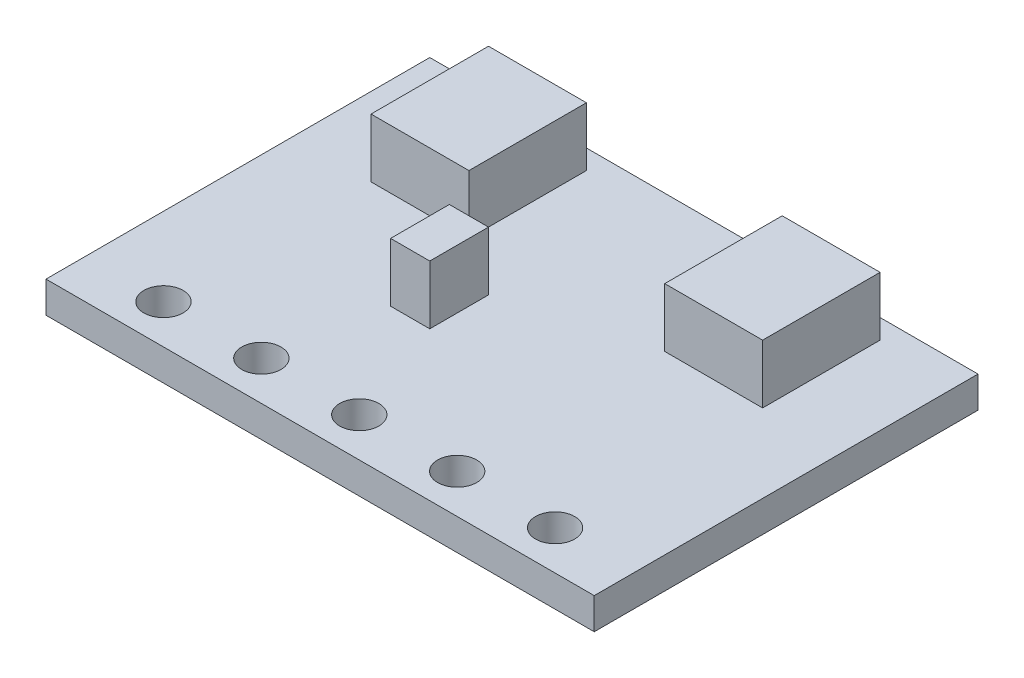
ISO-10303-21;
HEADER;
FILE_DESCRIPTION(('STEP AP214'),'2;1');
FILE_NAME('part.step','',(''),(''),'','','');
FILE_SCHEMA(('AUTOMOTIVE_DESIGN { 1 0 10303 214 1 1 1 1 }'));
ENDSEC;
DATA;
#1=APPLICATION_CONTEXT('core data for automotive mechanical design processes');
#2=APPLICATION_PROTOCOL_DEFINITION('international standard','automotive_design',2000,#1);
#3=PRODUCT_CONTEXT('',#1,'mechanical');
#4=PRODUCT('Part','Part','',(#3));
#5=PRODUCT_RELATED_PRODUCT_CATEGORY('part','',(#4));
#6=PRODUCT_DEFINITION_FORMATION('','',#4);
#7=PRODUCT_DEFINITION_CONTEXT('part definition',#1,'design');
#8=PRODUCT_DEFINITION('design','',#6,#7);
#9=PRODUCT_DEFINITION_SHAPE('','',#8);
#10=(LENGTH_UNIT() NAMED_UNIT(*) SI_UNIT(.MILLI.,.METRE.));
#11=(NAMED_UNIT(*) PLANE_ANGLE_UNIT() SI_UNIT($,.RADIAN.));
#12=(NAMED_UNIT(*) SI_UNIT($,.STERADIAN.) SOLID_ANGLE_UNIT());
#13=UNCERTAINTY_MEASURE_WITH_UNIT(LENGTH_MEASURE(1.E-05),#10,'distance_accuracy_value','');
#14=(GEOMETRIC_REPRESENTATION_CONTEXT(3) GLOBAL_UNCERTAINTY_ASSIGNED_CONTEXT((#13)) GLOBAL_UNIT_ASSIGNED_CONTEXT((#10,
#11,#12)) REPRESENTATION_CONTEXT('',''));
#15=CARTESIAN_POINT('',(0.,0.,0.));
#16=DIRECTION('',(0.,0.,1.));
#17=DIRECTION('',(1.,0.,0.));
#18=AXIS2_PLACEMENT_3D('',#15,#16,#17);
#19=CARTESIAN_POINT('',(7.,3.3,4.9));
#20=DIRECTION('',(-1.,0.,0.));
#21=DIRECTION('',(0.,0.,1.));
#22=AXIS2_PLACEMENT_3D('',#19,#20,#21);
#23=PLANE('',#22);
#24=DIRECTION('',(0.,0.,1.));
#25=VECTOR('',#24,1.);
#26=CARTESIAN_POINT('',(7.,1.,0.));
#27=LINE('',#26,#25);
#28=CARTESIAN_POINT('',(7.,1.,-4.9));
#29=VERTEX_POINT('',#28);
#30=CARTESIAN_POINT('',(7.,1.,4.9));
#31=VERTEX_POINT('',#30);
#32=EDGE_CURVE('E60',#29,#31,#27,.T.);
#33=ORIENTED_EDGE('',*,*,#32,.F.);
#34=DIRECTION('',(0.,-1.,0.));
#35=VECTOR('',#34,1.);
#36=CARTESIAN_POINT('',(7.,3.3,-4.9));
#37=LINE('',#36,#35);
#38=CARTESIAN_POINT('',(7.,1.8,-4.9));
#39=VERTEX_POINT('',#38);
#40=EDGE_CURVE('E11',#39,#29,#37,.T.);
#41=ORIENTED_EDGE('',*,*,#40,.F.);
#42=DIRECTION('',(0.,0.,-1.));
#43=VECTOR('',#42,1.);
#44=CARTESIAN_POINT('',(7.,1.8,0.));
#45=LINE('',#44,#43);
#46=CARTESIAN_POINT('',(7.,1.8,4.9));
#47=VERTEX_POINT('',#46);
#48=EDGE_CURVE('E207',#47,#39,#45,.T.);
#49=ORIENTED_EDGE('',*,*,#48,.F.);
#50=DIRECTION('',(0.,-1.,0.));
#51=VECTOR('',#50,1.);
#52=CARTESIAN_POINT('',(7.,3.3,4.9));
#53=LINE('',#52,#51);
#54=EDGE_CURVE('E196',#47,#31,#53,.T.);
#55=ORIENTED_EDGE('',*,*,#54,.T.);
#56=EDGE_LOOP('',(#33,#41,#49,#55));
#57=FACE_BOUND('',#56,.T.);
#58=ADVANCED_FACE('F45',(#57),#23,.F.);
#59=CARTESIAN_POINT('',(-7.,3.3,-4.9));
#60=DIRECTION('',(0.,0.,1.));
#61=DIRECTION('',(1.,0.,0.));
#62=AXIS2_PLACEMENT_3D('',#59,#60,#61);
#63=PLANE('',#62);
#64=DIRECTION('',(1.,0.,0.));
#65=VECTOR('',#64,1.);
#66=CARTESIAN_POINT('',(0.,1.,-4.9));
#67=LINE('',#66,#65);
#68=CARTESIAN_POINT('',(-7.,1.,-4.9));
#69=VERTEX_POINT('',#68);
#70=EDGE_CURVE('E180',#69,#29,#67,.T.);
#71=ORIENTED_EDGE('',*,*,#70,.F.);
#72=DIRECTION('',(0.,-1.,0.));
#73=VECTOR('',#72,1.);
#74=CARTESIAN_POINT('',(-7.,3.3,-4.9));
#75=LINE('',#74,#73);
#76=CARTESIAN_POINT('',(-7.,1.8,-4.9));
#77=VERTEX_POINT('',#76);
#78=EDGE_CURVE('E53',#77,#69,#75,.T.);
#79=ORIENTED_EDGE('',*,*,#78,.F.);
#80=DIRECTION('',(-1.,0.,0.));
#81=VECTOR('',#80,1.);
#82=CARTESIAN_POINT('',(0.,1.8,-4.9));
#83=LINE('',#82,#81);
#84=EDGE_CURVE('E202',#39,#77,#83,.T.);
#85=ORIENTED_EDGE('',*,*,#84,.F.);
#86=ORIENTED_EDGE('',*,*,#40,.T.);
#87=EDGE_LOOP('',(#71,#79,#85,#86));
#88=FACE_BOUND('',#87,.T.);
#89=ADVANCED_FACE('F201',(#88),#63,.F.);
#90=CARTESIAN_POINT('',(-7.,3.3,4.9));
#91=DIRECTION('',(1.,0.,0.));
#92=DIRECTION('',(0.,0.,-1.));
#93=AXIS2_PLACEMENT_3D('',#90,#91,#92);
#94=PLANE('',#93);
#95=DIRECTION('',(0.,0.,-1.));
#96=VECTOR('',#95,1.);
#97=CARTESIAN_POINT('',(-7.,1.,0.));
#98=LINE('',#97,#96);
#99=CARTESIAN_POINT('',(-7.,1.,4.9));
#100=VERTEX_POINT('',#99);
#101=EDGE_CURVE('E184',#100,#69,#98,.T.);
#102=ORIENTED_EDGE('',*,*,#101,.F.);
#103=DIRECTION('',(0.,-1.,0.));
#104=VECTOR('',#103,1.);
#105=CARTESIAN_POINT('',(-7.,3.3,4.9));
#106=LINE('',#105,#104);
#107=CARTESIAN_POINT('',(-7.,1.8,4.9));
#108=VERTEX_POINT('',#107);
#109=EDGE_CURVE('E307',#108,#100,#106,.T.);
#110=ORIENTED_EDGE('',*,*,#109,.F.);
#111=DIRECTION('',(0.,0.,1.));
#112=VECTOR('',#111,1.);
#113=CARTESIAN_POINT('',(-7.,1.8,0.));
#114=LINE('',#113,#112);
#115=EDGE_CURVE('E206',#77,#108,#114,.T.);
#116=ORIENTED_EDGE('',*,*,#115,.F.);
#117=ORIENTED_EDGE('',*,*,#78,.T.);
#118=EDGE_LOOP('',(#102,#110,#116,#117));
#119=FACE_BOUND('',#118,.T.);
#120=ADVANCED_FACE('F312',(#119),#94,.F.);
#121=CARTESIAN_POINT('',(-7.,3.3,4.9));
#122=DIRECTION('',(0.,0.,-1.));
#123=DIRECTION('',(-1.,0.,0.));
#124=AXIS2_PLACEMENT_3D('',#121,#122,#123);
#125=PLANE('',#124);
#126=DIRECTION('',(-1.,0.,0.));
#127=VECTOR('',#126,1.);
#128=CARTESIAN_POINT('',(0.,1.,4.9));
#129=LINE('',#128,#127);
#130=EDGE_CURVE('E198',#31,#100,#129,.T.);
#131=ORIENTED_EDGE('',*,*,#130,.F.);
#132=ORIENTED_EDGE('',*,*,#54,.F.);
#133=DIRECTION('',(1.,0.,0.));
#134=VECTOR('',#133,1.);
#135=CARTESIAN_POINT('',(0.,1.8,4.9));
#136=LINE('',#135,#134);
#137=EDGE_CURVE('E213',#108,#47,#136,.T.);
#138=ORIENTED_EDGE('',*,*,#137,.F.);
#139=ORIENTED_EDGE('',*,*,#109,.T.);
#140=EDGE_LOOP('',(#131,#132,#138,#139));
#141=FACE_BOUND('',#140,.T.);
#142=ADVANCED_FACE('F317',(#141),#125,.F.);
#143=CARTESIAN_POINT('',(-2.5,1.8,0.));
#144=DIRECTION('',(1.,0.,0.));
#145=DIRECTION('',(0.,0.,-1.));
#146=AXIS2_PLACEMENT_3D('',#143,#144,#145);
#147=PLANE('',#146);
#148=DIRECTION('',(0.,0.,-1.));
#149=VECTOR('',#148,1.);
#150=CARTESIAN_POINT('',(-2.5,3.3,0.));
#151=LINE('',#150,#149);
#152=CARTESIAN_POINT('',(-2.5,3.3,-1.4));
#153=VERTEX_POINT('',#152);
#154=CARTESIAN_POINT('',(-2.5,3.3,-4.4));
#155=VERTEX_POINT('',#154);
#156=EDGE_CURVE('E250',#153,#155,#151,.T.);
#157=ORIENTED_EDGE('',*,*,#156,.F.);
#158=DIRECTION('',(0.,1.,0.));
#159=VECTOR('',#158,1.);
#160=CARTESIAN_POINT('',(-2.5,1.8,-1.4));
#161=LINE('',#160,#159);
#162=CARTESIAN_POINT('',(-2.5,1.8,-1.4));
#163=VERTEX_POINT('',#162);
#164=EDGE_CURVE('E276',#163,#153,#161,.T.);
#165=ORIENTED_EDGE('',*,*,#164,.F.);
#166=DIRECTION('',(0.,0.,-1.));
#167=VECTOR('',#166,1.);
#168=CARTESIAN_POINT('',(-2.5,1.8,0.));
#169=LINE('',#168,#167);
#170=CARTESIAN_POINT('',(-2.5,1.8,-4.4));
#171=VERTEX_POINT('',#170);
#172=EDGE_CURVE('E331',#163,#171,#169,.T.);
#173=ORIENTED_EDGE('',*,*,#172,.T.);
#174=DIRECTION('',(0.,1.,0.));
#175=VECTOR('',#174,1.);
#176=CARTESIAN_POINT('',(-2.5,1.8,-4.4));
#177=LINE('',#176,#175);
#178=EDGE_CURVE('E267',#171,#155,#177,.T.);
#179=ORIENTED_EDGE('',*,*,#178,.T.);
#180=EDGE_LOOP('',(#157,#165,#173,#179));
#181=FACE_BOUND('',#180,.T.);
#182=ADVANCED_FACE('F485',(#181),#147,.T.);
#183=CARTESIAN_POINT('',(0.,1.8,-4.4));
#184=DIRECTION('',(0.,0.,1.));
#185=DIRECTION('',(1.,0.,0.));
#186=AXIS2_PLACEMENT_3D('',#183,#184,#185);
#187=PLANE('',#186);
#188=DIRECTION('',(1.,0.,0.));
#189=VECTOR('',#188,1.);
#190=CARTESIAN_POINT('',(0.,3.3,-4.4));
#191=LINE('',#190,#189);
#192=CARTESIAN_POINT('',(-5.,3.3,-4.4));
#193=VERTEX_POINT('',#192);
#194=EDGE_CURVE('E262',#193,#155,#191,.T.);
#195=ORIENTED_EDGE('',*,*,#194,.T.);
#196=ORIENTED_EDGE('',*,*,#178,.F.);
#197=DIRECTION('',(1.,0.,0.));
#198=VECTOR('',#197,1.);
#199=CARTESIAN_POINT('',(0.,1.8,-4.4));
#200=LINE('',#199,#198);
#201=CARTESIAN_POINT('',(-5.,1.8,-4.4));
#202=VERTEX_POINT('',#201);
#203=EDGE_CURVE('E319',#202,#171,#200,.T.);
#204=ORIENTED_EDGE('',*,*,#203,.F.);
#205=DIRECTION('',(0.,1.,0.));
#206=VECTOR('',#205,1.);
#207=CARTESIAN_POINT('',(-5.,1.8,-4.4));
#208=LINE('',#207,#206);
#209=EDGE_CURVE('E270',#202,#193,#208,.T.);
#210=ORIENTED_EDGE('',*,*,#209,.T.);
#211=EDGE_LOOP('',(#195,#196,#204,#210));
#212=FACE_BOUND('',#211,.T.);
#213=ADVANCED_FACE('F529',(#212),#187,.F.);
#214=CARTESIAN_POINT('',(-5.,1.8,0.));
#215=DIRECTION('',(1.,0.,0.));
#216=DIRECTION('',(0.,0.,-1.));
#217=AXIS2_PLACEMENT_3D('',#214,#215,#216);
#218=PLANE('',#217);
#219=DIRECTION('',(0.,0.,-1.));
#220=VECTOR('',#219,1.);
#221=CARTESIAN_POINT('',(-5.,3.3,0.));
#222=LINE('',#221,#220);
#223=CARTESIAN_POINT('',(-5.,3.3,-1.4));
#224=VERTEX_POINT('',#223);
#225=EDGE_CURVE('E258',#224,#193,#222,.T.);
#226=ORIENTED_EDGE('',*,*,#225,.T.);
#227=ORIENTED_EDGE('',*,*,#209,.F.);
#228=DIRECTION('',(0.,0.,-1.));
#229=VECTOR('',#228,1.);
#230=CARTESIAN_POINT('',(-5.,1.8,0.));
#231=LINE('',#230,#229);
#232=CARTESIAN_POINT('',(-5.,1.8,-1.4));
#233=VERTEX_POINT('',#232);
#234=EDGE_CURVE('E322',#233,#202,#231,.T.);
#235=ORIENTED_EDGE('',*,*,#234,.F.);
#236=DIRECTION('',(0.,1.,0.));
#237=VECTOR('',#236,1.);
#238=CARTESIAN_POINT('',(-5.,1.8,-1.4));
#239=LINE('',#238,#237);
#240=EDGE_CURVE('E273',#233,#224,#239,.T.);
#241=ORIENTED_EDGE('',*,*,#240,.T.);
#242=EDGE_LOOP('',(#226,#227,#235,#241));
#243=FACE_BOUND('',#242,.T.);
#244=ADVANCED_FACE('F516',(#243),#218,.F.);
#245=CARTESIAN_POINT('',(5.,1.8,0.));
#246=DIRECTION('',(1.,0.,0.));
#247=DIRECTION('',(0.,0.,-1.));
#248=AXIS2_PLACEMENT_3D('',#245,#246,#247);
#249=PLANE('',#248);
#250=DIRECTION('',(0.,0.,-1.));
#251=VECTOR('',#250,1.);
#252=CARTESIAN_POINT('',(5.,3.3,0.));
#253=LINE('',#252,#251);
#254=CARTESIAN_POINT('',(5.,3.3,-1.4));
#255=VERTEX_POINT('',#254);
#256=CARTESIAN_POINT('',(5.,3.3,-4.4));
#257=VERTEX_POINT('',#256);
#258=EDGE_CURVE('E234',#255,#257,#253,.T.);
#259=ORIENTED_EDGE('',*,*,#258,.F.);
#260=DIRECTION('',(0.,1.,0.));
#261=VECTOR('',#260,1.);
#262=CARTESIAN_POINT('',(5.,1.8,-1.4));
#263=LINE('',#262,#261);
#264=CARTESIAN_POINT('',(5.,1.8,-1.4));
#265=VERTEX_POINT('',#264);
#266=EDGE_CURVE('E289',#265,#255,#263,.T.);
#267=ORIENTED_EDGE('',*,*,#266,.F.);
#268=DIRECTION('',(0.,0.,-1.));
#269=VECTOR('',#268,1.);
#270=CARTESIAN_POINT('',(5.,1.8,0.));
#271=LINE('',#270,#269);
#272=CARTESIAN_POINT('',(5.,1.8,-4.4));
#273=VERTEX_POINT('',#272);
#274=EDGE_CURVE('E345',#265,#273,#271,.T.);
#275=ORIENTED_EDGE('',*,*,#274,.T.);
#276=DIRECTION('',(0.,1.,0.));
#277=VECTOR('',#276,1.);
#278=CARTESIAN_POINT('',(5.,1.8,-4.4));
#279=LINE('',#278,#277);
#280=EDGE_CURVE('E280',#273,#257,#279,.T.);
#281=ORIENTED_EDGE('',*,*,#280,.T.);
#282=EDGE_LOOP('',(#259,#267,#275,#281));
#283=FACE_BOUND('',#282,.T.);
#284=ADVANCED_FACE('F512',(#283),#249,.T.);
#285=CARTESIAN_POINT('',(0.,1.8,-4.4));
#286=DIRECTION('',(0.,0.,1.));
#287=DIRECTION('',(1.,0.,0.));
#288=AXIS2_PLACEMENT_3D('',#285,#286,#287);
#289=PLANE('',#288);
#290=DIRECTION('',(1.,0.,0.));
#291=VECTOR('',#290,1.);
#292=CARTESIAN_POINT('',(0.,3.3,-4.4));
#293=LINE('',#292,#291);
#294=CARTESIAN_POINT('',(2.5,3.3,-4.4));
#295=VERTEX_POINT('',#294);
#296=EDGE_CURVE('E246',#295,#257,#293,.T.);
#297=ORIENTED_EDGE('',*,*,#296,.T.);
#298=ORIENTED_EDGE('',*,*,#280,.F.);
#299=DIRECTION('',(1.,0.,0.));
#300=VECTOR('',#299,1.);
#301=CARTESIAN_POINT('',(0.,1.8,-4.4));
#302=LINE('',#301,#300);
#303=CARTESIAN_POINT('',(2.5,1.8,-4.4));
#304=VERTEX_POINT('',#303);
#305=EDGE_CURVE('E334',#304,#273,#302,.T.);
#306=ORIENTED_EDGE('',*,*,#305,.F.);
#307=DIRECTION('',(0.,1.,0.));
#308=VECTOR('',#307,1.);
#309=CARTESIAN_POINT('',(2.5,1.8,-4.4));
#310=LINE('',#309,#308);
#311=EDGE_CURVE('E283',#304,#295,#310,.T.);
#312=ORIENTED_EDGE('',*,*,#311,.T.);
#313=EDGE_LOOP('',(#297,#298,#306,#312));
#314=FACE_BOUND('',#313,.T.);
#315=ADVANCED_FACE('F515',(#314),#289,.F.);
#316=CARTESIAN_POINT('',(2.5,1.8,0.));
#317=DIRECTION('',(1.,0.,0.));
#318=DIRECTION('',(0.,0.,-1.));
#319=AXIS2_PLACEMENT_3D('',#316,#317,#318);
#320=PLANE('',#319);
#321=DIRECTION('',(0.,0.,-1.));
#322=VECTOR('',#321,1.);
#323=CARTESIAN_POINT('',(2.5,3.3,0.));
#324=LINE('',#323,#322);
#325=CARTESIAN_POINT('',(2.5,3.3,-1.4));
#326=VERTEX_POINT('',#325);
#327=EDGE_CURVE('E242',#326,#295,#324,.T.);
#328=ORIENTED_EDGE('',*,*,#327,.T.);
#329=ORIENTED_EDGE('',*,*,#311,.F.);
#330=DIRECTION('',(0.,0.,-1.));
#331=VECTOR('',#330,1.);
#332=CARTESIAN_POINT('',(2.5,1.8,0.));
#333=LINE('',#332,#331);
#334=CARTESIAN_POINT('',(2.5,1.8,-1.4));
#335=VERTEX_POINT('',#334);
#336=EDGE_CURVE('E338',#335,#304,#333,.T.);
#337=ORIENTED_EDGE('',*,*,#336,.F.);
#338=DIRECTION('',(0.,1.,0.));
#339=VECTOR('',#338,1.);
#340=CARTESIAN_POINT('',(2.5,1.8,-1.4));
#341=LINE('',#340,#339);
#342=EDGE_CURVE('E286',#335,#326,#341,.T.);
#343=ORIENTED_EDGE('',*,*,#342,.T.);
#344=EDGE_LOOP('',(#328,#329,#337,#343));
#345=FACE_BOUND('',#344,.T.);
#346=ADVANCED_FACE('F497',(#345),#320,.F.);
#347=CARTESIAN_POINT('',(-1.,1.8,0.));
#348=DIRECTION('',(1.,0.,0.));
#349=DIRECTION('',(0.,0.,-1.));
#350=AXIS2_PLACEMENT_3D('',#347,#348,#349);
#351=PLANE('',#350);
#352=DIRECTION('',(0.,0.,-1.));
#353=VECTOR('',#352,1.);
#354=CARTESIAN_POINT('',(-1.,3.3,0.));
#355=LINE('',#354,#353);
#356=CARTESIAN_POINT('',(-1.,3.3,1.1));
#357=VERTEX_POINT('',#356);
#358=CARTESIAN_POINT('',(-1.,3.3,-0.4));
#359=VERTEX_POINT('',#358);
#360=EDGE_CURVE('E217',#357,#359,#355,.T.);
#361=ORIENTED_EDGE('',*,*,#360,.F.);
#362=DIRECTION('',(0.,1.,0.));
#363=VECTOR('',#362,1.);
#364=CARTESIAN_POINT('',(-1.,1.8,1.1));
#365=LINE('',#364,#363);
#366=CARTESIAN_POINT('',(-1.,1.8,1.1));
#367=VERTEX_POINT('',#366);
#368=EDGE_CURVE('E211',#367,#357,#365,.T.);
#369=ORIENTED_EDGE('',*,*,#368,.F.);
#370=DIRECTION('',(0.,0.,-1.));
#371=VECTOR('',#370,1.);
#372=CARTESIAN_POINT('',(-1.,1.8,0.));
#373=LINE('',#372,#371);
#374=CARTESIAN_POINT('',(-1.,1.8,-0.4));
#375=VERTEX_POINT('',#374);
#376=EDGE_CURVE('E266',#367,#375,#373,.T.);
#377=ORIENTED_EDGE('',*,*,#376,.T.);
#378=DIRECTION('',(0.,1.,0.));
#379=VECTOR('',#378,1.);
#380=CARTESIAN_POINT('',(-1.,1.8,-0.4));
#381=LINE('',#380,#379);
#382=EDGE_CURVE('E293',#375,#359,#381,.T.);
#383=ORIENTED_EDGE('',*,*,#382,.T.);
#384=EDGE_LOOP('',(#361,#369,#377,#383));
#385=FACE_BOUND('',#384,.T.);
#386=ADVANCED_FACE('F493',(#385),#351,.T.);
#387=CARTESIAN_POINT('',(0.,1.8,-0.4));
#388=DIRECTION('',(0.,0.,1.));
#389=DIRECTION('',(1.,0.,0.));
#390=AXIS2_PLACEMENT_3D('',#387,#388,#389);
#391=PLANE('',#390);
#392=DIRECTION('',(1.,0.,0.));
#393=VECTOR('',#392,1.);
#394=CARTESIAN_POINT('',(0.,3.3,-0.4));
#395=LINE('',#394,#393);
#396=CARTESIAN_POINT('',(-2.,3.3,-0.4));
#397=VERTEX_POINT('',#396);
#398=EDGE_CURVE('E230',#397,#359,#395,.T.);
#399=ORIENTED_EDGE('',*,*,#398,.T.);
#400=ORIENTED_EDGE('',*,*,#382,.F.);
#401=DIRECTION('',(1.,0.,0.));
#402=VECTOR('',#401,1.);
#403=CARTESIAN_POINT('',(0.,1.8,-0.4));
#404=LINE('',#403,#402);
#405=CARTESIAN_POINT('',(-2.,1.8,-0.4));
#406=VERTEX_POINT('',#405);
#407=EDGE_CURVE('E348',#406,#375,#404,.T.);
#408=ORIENTED_EDGE('',*,*,#407,.F.);
#409=DIRECTION('',(0.,1.,0.));
#410=VECTOR('',#409,1.);
#411=CARTESIAN_POINT('',(-2.,1.8,-0.4));
#412=LINE('',#411,#410);
#413=EDGE_CURVE('E296',#406,#397,#412,.T.);
#414=ORIENTED_EDGE('',*,*,#413,.T.);
#415=EDGE_LOOP('',(#399,#400,#408,#414));
#416=FACE_BOUND('',#415,.T.);
#417=ADVANCED_FACE('F496',(#416),#391,.F.);
#418=CARTESIAN_POINT('',(-2.,1.8,0.));
#419=DIRECTION('',(1.,0.,0.));
#420=DIRECTION('',(0.,0.,-1.));
#421=AXIS2_PLACEMENT_3D('',#418,#419,#420);
#422=PLANE('',#421);
#423=DIRECTION('',(0.,0.,-1.));
#424=VECTOR('',#423,1.);
#425=CARTESIAN_POINT('',(-2.,3.3,0.));
#426=LINE('',#425,#424);
#427=CARTESIAN_POINT('',(-2.,3.3,1.1));
#428=VERTEX_POINT('',#427);
#429=EDGE_CURVE('E226',#428,#397,#426,.T.);
#430=ORIENTED_EDGE('',*,*,#429,.T.);
#431=ORIENTED_EDGE('',*,*,#413,.F.);
#432=DIRECTION('',(0.,0.,-1.));
#433=VECTOR('',#432,1.);
#434=CARTESIAN_POINT('',(-2.,1.8,0.));
#435=LINE('',#434,#433);
#436=CARTESIAN_POINT('',(-2.,1.8,1.1));
#437=VERTEX_POINT('',#436);
#438=EDGE_CURVE('E352',#437,#406,#435,.T.);
#439=ORIENTED_EDGE('',*,*,#438,.F.);
#440=DIRECTION('',(0.,1.,0.));
#441=VECTOR('',#440,1.);
#442=CARTESIAN_POINT('',(-2.,1.8,1.1));
#443=LINE('',#442,#441);
#444=EDGE_CURVE('E299',#437,#428,#443,.T.);
#445=ORIENTED_EDGE('',*,*,#444,.T.);
#446=EDGE_LOOP('',(#430,#431,#439,#445));
#447=FACE_BOUND('',#446,.T.);
#448=ADVANCED_FACE('F504',(#447),#422,.F.);
#449=CARTESIAN_POINT('',(0.,1.8,-1.4));
#450=DIRECTION('',(0.,0.,1.));
#451=DIRECTION('',(1.,0.,0.));
#452=AXIS2_PLACEMENT_3D('',#449,#450,#451);
#453=PLANE('',#452);
#454=DIRECTION('',(1.,0.,0.));
#455=VECTOR('',#454,1.);
#456=CARTESIAN_POINT('',(0.,3.3,-1.4));
#457=LINE('',#456,#455);
#458=EDGE_CURVE('E254',#224,#153,#457,.T.);
#459=ORIENTED_EDGE('',*,*,#458,.F.);
#460=ORIENTED_EDGE('',*,*,#240,.F.);
#461=DIRECTION('',(1.,0.,0.));
#462=VECTOR('',#461,1.);
#463=CARTESIAN_POINT('',(0.,1.8,-1.4));
#464=LINE('',#463,#462);
#465=EDGE_CURVE('E328',#233,#163,#464,.T.);
#466=ORIENTED_EDGE('',*,*,#465,.T.);
#467=ORIENTED_EDGE('',*,*,#164,.T.);
#468=EDGE_LOOP('',(#459,#460,#466,#467));
#469=FACE_BOUND('',#468,.T.);
#470=ADVANCED_FACE('F507',(#469),#453,.T.);
#471=CARTESIAN_POINT('',(0.,1.8,-1.4));
#472=DIRECTION('',(0.,0.,1.));
#473=DIRECTION('',(1.,0.,0.));
#474=AXIS2_PLACEMENT_3D('',#471,#472,#473);
#475=PLANE('',#474);
#476=DIRECTION('',(1.,0.,0.));
#477=VECTOR('',#476,1.);
#478=CARTESIAN_POINT('',(0.,3.3,-1.4));
#479=LINE('',#478,#477);
#480=EDGE_CURVE('E238',#326,#255,#479,.T.);
#481=ORIENTED_EDGE('',*,*,#480,.F.);
#482=ORIENTED_EDGE('',*,*,#342,.F.);
#483=DIRECTION('',(1.,0.,0.));
#484=VECTOR('',#483,1.);
#485=CARTESIAN_POINT('',(0.,1.8,-1.4));
#486=LINE('',#485,#484);
#487=EDGE_CURVE('E342',#335,#265,#486,.T.);
#488=ORIENTED_EDGE('',*,*,#487,.T.);
#489=ORIENTED_EDGE('',*,*,#266,.T.);
#490=EDGE_LOOP('',(#481,#482,#488,#489));
#491=FACE_BOUND('',#490,.T.);
#492=ADVANCED_FACE('F502',(#491),#475,.T.);
#493=CARTESIAN_POINT('',(0.,1.8,1.1));
#494=DIRECTION('',(0.,0.,1.));
#495=DIRECTION('',(1.,0.,0.));
#496=AXIS2_PLACEMENT_3D('',#493,#494,#495);
#497=PLANE('',#496);
#498=DIRECTION('',(1.,0.,0.));
#499=VECTOR('',#498,1.);
#500=CARTESIAN_POINT('',(0.,3.3,1.1));
#501=LINE('',#500,#499);
#502=EDGE_CURVE('E221',#428,#357,#501,.T.);
#503=ORIENTED_EDGE('',*,*,#502,.F.);
#504=ORIENTED_EDGE('',*,*,#444,.F.);
#505=DIRECTION('',(1.,0.,0.));
#506=VECTOR('',#505,1.);
#507=CARTESIAN_POINT('',(0.,1.8,1.1));
#508=LINE('',#507,#506);
#509=EDGE_CURVE('E356',#437,#367,#508,.T.);
#510=ORIENTED_EDGE('',*,*,#509,.T.);
#511=ORIENTED_EDGE('',*,*,#368,.T.);
#512=EDGE_LOOP('',(#503,#504,#510,#511));
#513=FACE_BOUND('',#512,.T.);
#514=ADVANCED_FACE('F499',(#513),#497,.T.);
#515=CARTESIAN_POINT('',(0.,1.8,0.));
#516=DIRECTION('',(0.,1.,0.));
#517=DIRECTION('',(0.,0.,1.));
#518=AXIS2_PLACEMENT_3D('',#515,#516,#517);
#519=PLANE('',#518);
#520=CARTESIAN_POINT('',(-5.,1.8,3.9));
#521=DIRECTION('',(0.,1.,0.));
#522=DIRECTION('',(0.,0.,1.));
#523=AXIS2_PLACEMENT_3D('',#520,#521,#522);
#524=CIRCLE('',#523,0.500000000000001);
#525=CARTESIAN_POINT('',(-5.,1.8,4.4));
#526=VERTEX_POINT('',#525);
#527=EDGE_CURVE('E387',#526,#526,#524,.T.);
#528=ORIENTED_EDGE('',*,*,#527,.F.);
#529=EDGE_LOOP('',(#528));
#530=FACE_BOUND('',#529,.T.);
#531=CARTESIAN_POINT('',(-2.5,1.8,3.9));
#532=DIRECTION('',(0.,1.,0.));
#533=DIRECTION('',(0.,0.,1.));
#534=AXIS2_PLACEMENT_3D('',#531,#532,#533);
#535=CIRCLE('',#534,0.5);
#536=CARTESIAN_POINT('',(-2.5,1.8,4.4));
#537=VERTEX_POINT('',#536);
#538=EDGE_CURVE('E409',#537,#537,#535,.T.);
#539=ORIENTED_EDGE('',*,*,#538,.F.);
#540=EDGE_LOOP('',(#539));
#541=FACE_BOUND('',#540,.T.);
#542=CARTESIAN_POINT('',(0.,1.8,3.9));
#543=DIRECTION('',(0.,1.,0.));
#544=DIRECTION('',(0.,0.,1.));
#545=AXIS2_PLACEMENT_3D('',#542,#543,#544);
#546=CIRCLE('',#545,0.500000000000001);
#547=CARTESIAN_POINT('',(0.,1.8,4.4));
#548=VERTEX_POINT('',#547);
#549=EDGE_CURVE('E413',#548,#548,#546,.T.);
#550=ORIENTED_EDGE('',*,*,#549,.F.);
#551=EDGE_LOOP('',(#550));
#552=FACE_BOUND('',#551,.T.);
#553=CARTESIAN_POINT('',(2.5,1.8,3.9));
#554=DIRECTION('',(0.,1.,0.));
#555=DIRECTION('',(0.,0.,1.));
#556=AXIS2_PLACEMENT_3D('',#553,#554,#555);
#557=CIRCLE('',#556,0.5);
#558=CARTESIAN_POINT('',(2.5,1.8,4.4));
#559=VERTEX_POINT('',#558);
#560=EDGE_CURVE('E417',#559,#559,#557,.T.);
#561=ORIENTED_EDGE('',*,*,#560,.F.);
#562=EDGE_LOOP('',(#561));
#563=FACE_BOUND('',#562,.T.);
#564=CARTESIAN_POINT('',(5.,1.8,3.9));
#565=DIRECTION('',(0.,1.,0.));
#566=DIRECTION('',(0.,0.,1.));
#567=AXIS2_PLACEMENT_3D('',#564,#565,#566);
#568=CIRCLE('',#567,0.500000000000001);
#569=CARTESIAN_POINT('',(5.,1.8,4.4));
#570=VERTEX_POINT('',#569);
#571=EDGE_CURVE('E421',#570,#570,#568,.T.);
#572=ORIENTED_EDGE('',*,*,#571,.F.);
#573=EDGE_LOOP('',(#572));
#574=FACE_BOUND('',#573,.T.);
#575=ORIENTED_EDGE('',*,*,#376,.F.);
#576=ORIENTED_EDGE('',*,*,#509,.F.);
#577=ORIENTED_EDGE('',*,*,#438,.T.);
#578=ORIENTED_EDGE('',*,*,#407,.T.);
#579=EDGE_LOOP('',(#575,#576,#577,#578));
#580=FACE_BOUND('',#579,.T.);
#581=ORIENTED_EDGE('',*,*,#274,.F.);
#582=ORIENTED_EDGE('',*,*,#487,.F.);
#583=ORIENTED_EDGE('',*,*,#336,.T.);
#584=ORIENTED_EDGE('',*,*,#305,.T.);
#585=EDGE_LOOP('',(#581,#582,#583,#584));
#586=FACE_BOUND('',#585,.T.);
#587=ORIENTED_EDGE('',*,*,#172,.F.);
#588=ORIENTED_EDGE('',*,*,#465,.F.);
#589=ORIENTED_EDGE('',*,*,#234,.T.);
#590=ORIENTED_EDGE('',*,*,#203,.T.);
#591=EDGE_LOOP('',(#587,#588,#589,#590));
#592=FACE_BOUND('',#591,.T.);
#593=ORIENTED_EDGE('',*,*,#137,.T.);
#594=ORIENTED_EDGE('',*,*,#48,.T.);
#595=ORIENTED_EDGE('',*,*,#84,.T.);
#596=ORIENTED_EDGE('',*,*,#115,.T.);
#597=EDGE_LOOP('',(#593,#594,#595,#596));
#598=FACE_BOUND('',#597,.T.);
#599=ADVANCED_FACE('F315',(#530,#541,#552,#563,#574,#580,#586,#592,#598),#519,.T.);
#600=CARTESIAN_POINT('',(0.,3.3,0.));
#601=DIRECTION('',(0.,-1.,0.));
#602=DIRECTION('',(0.,0.,-1.));
#603=AXIS2_PLACEMENT_3D('',#600,#601,#602);
#604=PLANE('',#603);
#605=ORIENTED_EDGE('',*,*,#258,.T.);
#606=ORIENTED_EDGE('',*,*,#296,.F.);
#607=ORIENTED_EDGE('',*,*,#327,.F.);
#608=ORIENTED_EDGE('',*,*,#480,.T.);
#609=EDGE_LOOP('',(#605,#606,#607,#608));
#610=FACE_BOUND('',#609,.T.);
#611=ADVANCED_FACE('F491',(#610),#604,.F.);
#612=ORIENTED_EDGE('',*,*,#156,.T.);
#613=ORIENTED_EDGE('',*,*,#194,.F.);
#614=ORIENTED_EDGE('',*,*,#225,.F.);
#615=ORIENTED_EDGE('',*,*,#458,.T.);
#616=EDGE_LOOP('',(#612,#613,#614,#615));
#617=FACE_BOUND('',#616,.T.);
#618=ADVANCED_FACE('F487',(#617),#604,.F.);
#619=ORIENTED_EDGE('',*,*,#360,.T.);
#620=ORIENTED_EDGE('',*,*,#398,.F.);
#621=ORIENTED_EDGE('',*,*,#429,.F.);
#622=ORIENTED_EDGE('',*,*,#502,.T.);
#623=EDGE_LOOP('',(#619,#620,#621,#622));
#624=FACE_BOUND('',#623,.T.);
#625=ADVANCED_FACE('F490',(#624),#604,.F.);
#626=CARTESIAN_POINT('',(0.,1.,-0.4));
#627=DIRECTION('',(0.,0.,-1.));
#628=DIRECTION('',(-1.,0.,0.));
#629=AXIS2_PLACEMENT_3D('',#626,#627,#628);
#630=PLANE('',#629);
#631=DIRECTION('',(1.,0.,0.));
#632=VECTOR('',#631,1.);
#633=CARTESIAN_POINT('',(0.,0.,-0.4));
#634=LINE('',#633,#632);
#635=CARTESIAN_POINT('',(-6.5,0.,-0.4));
#636=VERTEX_POINT('',#635);
#637=CARTESIAN_POINT('',(-5.5,0.,-0.4));
#638=VERTEX_POINT('',#637);
#639=EDGE_CURVE('E68',#636,#638,#634,.T.);
#640=ORIENTED_EDGE('',*,*,#639,.T.);
#641=DIRECTION('',(0.,-1.,0.));
#642=VECTOR('',#641,1.);
#643=CARTESIAN_POINT('',(-5.5,1.,-0.4));
#644=LINE('',#643,#642);
#645=CARTESIAN_POINT('',(-5.5,1.,-0.4));
#646=VERTEX_POINT('',#645);
#647=EDGE_CURVE('E361',#646,#638,#644,.T.);
#648=ORIENTED_EDGE('',*,*,#647,.F.);
#649=DIRECTION('',(1.,0.,0.));
#650=VECTOR('',#649,1.);
#651=CARTESIAN_POINT('',(0.,1.,-0.4));
#652=LINE('',#651,#650);
#653=CARTESIAN_POINT('',(-6.5,1.,-0.4));
#654=VERTEX_POINT('',#653);
#655=EDGE_CURVE('E398',#654,#646,#652,.T.);
#656=ORIENTED_EDGE('',*,*,#655,.F.);
#657=DIRECTION('',(0.,-1.,0.));
#658=VECTOR('',#657,1.);
#659=CARTESIAN_POINT('',(-6.5,1.,-0.4));
#660=LINE('',#659,#658);
#661=EDGE_CURVE('E222',#654,#636,#660,.T.);
#662=ORIENTED_EDGE('',*,*,#661,.T.);
#663=EDGE_LOOP('',(#640,#648,#656,#662));
#664=FACE_BOUND('',#663,.T.);
#665=ADVANCED_FACE('F543',(#664),#630,.F.);
#666=CARTESIAN_POINT('',(-6.5,1.,0.));
#667=DIRECTION('',(-1.,0.,0.));
#668=DIRECTION('',(0.,0.,1.));
#669=AXIS2_PLACEMENT_3D('',#666,#667,#668);
#670=PLANE('',#669);
#671=DIRECTION('',(0.,0.,-1.));
#672=VECTOR('',#671,1.);
#673=CARTESIAN_POINT('',(-6.5,0.,0.));
#674=LINE('',#673,#672);
#675=CARTESIAN_POINT('',(-6.5,0.,-2.4));
#676=VERTEX_POINT('',#675);
#677=EDGE_CURVE('E189',#636,#676,#674,.T.);
#678=ORIENTED_EDGE('',*,*,#677,.F.);
#679=ORIENTED_EDGE('',*,*,#661,.F.);
#680=DIRECTION('',(0.,0.,-1.));
#681=VECTOR('',#680,1.);
#682=CARTESIAN_POINT('',(-6.5,1.,0.));
#683=LINE('',#682,#681);
#684=CARTESIAN_POINT('',(-6.5,1.,-2.4));
#685=VERTEX_POINT('',#684);
#686=EDGE_CURVE('E365',#654,#685,#683,.T.);
#687=ORIENTED_EDGE('',*,*,#686,.T.);
#688=DIRECTION('',(0.,-1.,0.));
#689=VECTOR('',#688,1.);
#690=CARTESIAN_POINT('',(-6.5,1.,-2.4));
#691=LINE('',#690,#689);
#692=EDGE_CURVE('E368',#685,#676,#691,.T.);
#693=ORIENTED_EDGE('',*,*,#692,.T.);
#694=EDGE_LOOP('',(#678,#679,#687,#693));
#695=FACE_BOUND('',#694,.T.);
#696=ADVANCED_FACE('F546',(#695),#670,.T.);
#697=CARTESIAN_POINT('',(0.,1.,-2.4));
#698=DIRECTION('',(0.,0.,-1.));
#699=DIRECTION('',(-1.,0.,0.));
#700=AXIS2_PLACEMENT_3D('',#697,#698,#699);
#701=PLANE('',#700);
#702=DIRECTION('',(1.,0.,0.));
#703=VECTOR('',#702,1.);
#704=CARTESIAN_POINT('',(0.,0.,-2.4));
#705=LINE('',#704,#703);
#706=CARTESIAN_POINT('',(-5.5,0.,-2.4));
#707=VERTEX_POINT('',#706);
#708=EDGE_CURVE('E377',#676,#707,#705,.T.);
#709=ORIENTED_EDGE('',*,*,#708,.F.);
#710=ORIENTED_EDGE('',*,*,#692,.F.);
#711=DIRECTION('',(1.,0.,0.));
#712=VECTOR('',#711,1.);
#713=CARTESIAN_POINT('',(0.,1.,-2.4));
#714=LINE('',#713,#712);
#715=CARTESIAN_POINT('',(-5.5,1.,-2.4));
#716=VERTEX_POINT('',#715);
#717=EDGE_CURVE('E391',#685,#716,#714,.T.);
#718=ORIENTED_EDGE('',*,*,#717,.T.);
#719=DIRECTION('',(0.,-1.,0.));
#720=VECTOR('',#719,1.);
#721=CARTESIAN_POINT('',(-5.5,1.,-2.4));
#722=LINE('',#721,#720);
#723=EDGE_CURVE('E364',#716,#707,#722,.T.);
#724=ORIENTED_EDGE('',*,*,#723,.T.);
#725=EDGE_LOOP('',(#709,#710,#718,#724));
#726=FACE_BOUND('',#725,.T.);
#727=ADVANCED_FACE('F549',(#726),#701,.T.);
#728=CARTESIAN_POINT('',(-5.5,1.,0.));
#729=DIRECTION('',(-1.,0.,0.));
#730=DIRECTION('',(0.,0.,1.));
#731=AXIS2_PLACEMENT_3D('',#728,#729,#730);
#732=PLANE('',#731);
#733=DIRECTION('',(0.,0.,-1.));
#734=VECTOR('',#733,1.);
#735=CARTESIAN_POINT('',(-5.5,0.,0.));
#736=LINE('',#735,#734);
#737=EDGE_CURVE('E381',#638,#707,#736,.T.);
#738=ORIENTED_EDGE('',*,*,#737,.T.);
#739=ORIENTED_EDGE('',*,*,#723,.F.);
#740=DIRECTION('',(0.,0.,-1.));
#741=VECTOR('',#740,1.);
#742=CARTESIAN_POINT('',(-5.5,1.,0.));
#743=LINE('',#742,#741);
#744=EDGE_CURVE('E394',#646,#716,#743,.T.);
#745=ORIENTED_EDGE('',*,*,#744,.F.);
#746=ORIENTED_EDGE('',*,*,#647,.T.);
#747=EDGE_LOOP('',(#738,#739,#745,#746));
#748=FACE_BOUND('',#747,.T.);
#749=ADVANCED_FACE('F451',(#748),#732,.F.);
#750=CARTESIAN_POINT('',(0.,1.,0.));
#751=DIRECTION('',(0.,-1.,0.));
#752=DIRECTION('',(0.,0.,-1.));
#753=AXIS2_PLACEMENT_3D('',#750,#751,#752);
#754=PLANE('',#753);
#755=CARTESIAN_POINT('',(-5.,1.,3.9));
#756=DIRECTION('',(0.,-1.,0.));
#757=DIRECTION('',(0.,0.,-1.));
#758=AXIS2_PLACEMENT_3D('',#755,#756,#757);
#759=CIRCLE('',#758,0.500000000000001);
#760=CARTESIAN_POINT('',(-5.,1.,3.4));
#761=VERTEX_POINT('',#760);
#762=EDGE_CURVE('E425',#761,#761,#759,.T.);
#763=ORIENTED_EDGE('',*,*,#762,.F.);
#764=EDGE_LOOP('',(#763));
#765=FACE_BOUND('',#764,.T.);
#766=CARTESIAN_POINT('',(-2.5,1.,3.9));
#767=DIRECTION('',(0.,-1.,0.));
#768=DIRECTION('',(0.,0.,-1.));
#769=AXIS2_PLACEMENT_3D('',#766,#767,#768);
#770=CIRCLE('',#769,0.5);
#771=CARTESIAN_POINT('',(-2.5,1.,3.4));
#772=VERTEX_POINT('',#771);
#773=EDGE_CURVE('E438',#772,#772,#770,.T.);
#774=ORIENTED_EDGE('',*,*,#773,.F.);
#775=EDGE_LOOP('',(#774));
#776=FACE_BOUND('',#775,.T.);
#777=CARTESIAN_POINT('',(0.,1.,3.9));
#778=DIRECTION('',(0.,-1.,0.));
#779=DIRECTION('',(0.,0.,-1.));
#780=AXIS2_PLACEMENT_3D('',#777,#778,#779);
#781=CIRCLE('',#780,0.500000000000001);
#782=CARTESIAN_POINT('',(0.,1.,3.4));
#783=VERTEX_POINT('',#782);
#784=EDGE_CURVE('E434',#783,#783,#781,.T.);
#785=ORIENTED_EDGE('',*,*,#784,.F.);
#786=EDGE_LOOP('',(#785));
#787=FACE_BOUND('',#786,.T.);
#788=CARTESIAN_POINT('',(2.5,1.,3.9));
#789=DIRECTION('',(0.,-1.,0.));
#790=DIRECTION('',(0.,0.,-1.));
#791=AXIS2_PLACEMENT_3D('',#788,#789,#790);
#792=CIRCLE('',#791,0.5);
#793=CARTESIAN_POINT('',(2.5,1.,3.4));
#794=VERTEX_POINT('',#793);
#795=EDGE_CURVE('E430',#794,#794,#792,.T.);
#796=ORIENTED_EDGE('',*,*,#795,.F.);
#797=EDGE_LOOP('',(#796));
#798=FACE_BOUND('',#797,.T.);
#799=CARTESIAN_POINT('',(5.,1.,3.9));
#800=DIRECTION('',(0.,-1.,0.));
#801=DIRECTION('',(0.,0.,-1.));
#802=AXIS2_PLACEMENT_3D('',#799,#800,#801);
#803=CIRCLE('',#802,0.500000000000001);
#804=CARTESIAN_POINT('',(5.,1.,3.4));
#805=VERTEX_POINT('',#804);
#806=EDGE_CURVE('E426',#805,#805,#803,.T.);
#807=ORIENTED_EDGE('',*,*,#806,.F.);
#808=EDGE_LOOP('',(#807));
#809=FACE_BOUND('',#808,.T.);
#810=ORIENTED_EDGE('',*,*,#70,.T.);
#811=ORIENTED_EDGE('',*,*,#32,.T.);
#812=ORIENTED_EDGE('',*,*,#130,.T.);
#813=ORIENTED_EDGE('',*,*,#101,.T.);
#814=EDGE_LOOP('',(#810,#811,#812,#813));
#815=FACE_BOUND('',#814,.T.);
#816=ORIENTED_EDGE('',*,*,#655,.T.);
#817=ORIENTED_EDGE('',*,*,#744,.T.);
#818=ORIENTED_EDGE('',*,*,#717,.F.);
#819=ORIENTED_EDGE('',*,*,#686,.F.);
#820=EDGE_LOOP('',(#816,#817,#818,#819));
#821=FACE_BOUND('',#820,.T.);
#822=ADVANCED_FACE('F181',(#765,#776,#787,#798,#809,#815,#821),#754,.T.);
#823=CARTESIAN_POINT('',(0.,0.,0.));
#824=DIRECTION('',(0.,-1.,0.));
#825=DIRECTION('',(0.,0.,-1.));
#826=AXIS2_PLACEMENT_3D('',#823,#824,#825);
#827=PLANE('',#826);
#828=ORIENTED_EDGE('',*,*,#639,.F.);
#829=ORIENTED_EDGE('',*,*,#677,.T.);
#830=ORIENTED_EDGE('',*,*,#708,.T.);
#831=ORIENTED_EDGE('',*,*,#737,.F.);
#832=EDGE_LOOP('',(#828,#829,#830,#831));
#833=FACE_BOUND('',#832,.T.);
#834=ADVANCED_FACE('F450',(#833),#827,.T.);
#835=CARTESIAN_POINT('',(5.,2.,3.9));
#836=DIRECTION('',(0.,-1.,0.));
#837=DIRECTION('',(0.,0.,-1.));
#838=AXIS2_PLACEMENT_3D('',#835,#836,#837);
#839=CYLINDRICAL_SURFACE('',#838,0.500000000000001);
#840=ORIENTED_EDGE('',*,*,#571,.T.);
#841=EDGE_LOOP('',(#840));
#842=FACE_BOUND('',#841,.T.);
#843=ORIENTED_EDGE('',*,*,#806,.T.);
#844=EDGE_LOOP('',(#843));
#845=FACE_BOUND('',#844,.T.);
#846=ADVANCED_FACE('F461',(#842,#845),#839,.F.);
#847=CARTESIAN_POINT('',(2.5,2.,3.9));
#848=DIRECTION('',(0.,-1.,0.));
#849=DIRECTION('',(0.,0.,-1.));
#850=AXIS2_PLACEMENT_3D('',#847,#848,#849);
#851=CYLINDRICAL_SURFACE('',#850,0.5);
#852=ORIENTED_EDGE('',*,*,#560,.T.);
#853=EDGE_LOOP('',(#852));
#854=FACE_BOUND('',#853,.T.);
#855=ORIENTED_EDGE('',*,*,#795,.T.);
#856=EDGE_LOOP('',(#855));
#857=FACE_BOUND('',#856,.T.);
#858=ADVANCED_FACE('F463',(#854,#857),#851,.F.);
#859=CARTESIAN_POINT('',(0.,2.,3.9));
#860=DIRECTION('',(0.,-1.,0.));
#861=DIRECTION('',(0.,0.,-1.));
#862=AXIS2_PLACEMENT_3D('',#859,#860,#861);
#863=CYLINDRICAL_SURFACE('',#862,0.500000000000001);
#864=ORIENTED_EDGE('',*,*,#549,.T.);
#865=EDGE_LOOP('',(#864));
#866=FACE_BOUND('',#865,.T.);
#867=ORIENTED_EDGE('',*,*,#784,.T.);
#868=EDGE_LOOP('',(#867));
#869=FACE_BOUND('',#868,.T.);
#870=ADVANCED_FACE('F470',(#866,#869),#863,.F.);
#871=CARTESIAN_POINT('',(-2.5,2.,3.9));
#872=DIRECTION('',(0.,-1.,0.));
#873=DIRECTION('',(0.,0.,-1.));
#874=AXIS2_PLACEMENT_3D('',#871,#872,#873);
#875=CYLINDRICAL_SURFACE('',#874,0.5);
#876=ORIENTED_EDGE('',*,*,#538,.T.);
#877=EDGE_LOOP('',(#876));
#878=FACE_BOUND('',#877,.T.);
#879=ORIENTED_EDGE('',*,*,#773,.T.);
#880=EDGE_LOOP('',(#879));
#881=FACE_BOUND('',#880,.T.);
#882=ADVANCED_FACE('F761',(#878,#881),#875,.F.);
#883=CARTESIAN_POINT('',(-5.,2.,3.9));
#884=DIRECTION('',(0.,-1.,0.));
#885=DIRECTION('',(0.,0.,-1.));
#886=AXIS2_PLACEMENT_3D('',#883,#884,#885);
#887=CYLINDRICAL_SURFACE('',#886,0.500000000000001);
#888=ORIENTED_EDGE('',*,*,#527,.T.);
#889=EDGE_LOOP('',(#888));
#890=FACE_BOUND('',#889,.T.);
#891=ORIENTED_EDGE('',*,*,#762,.T.);
#892=EDGE_LOOP('',(#891));
#893=FACE_BOUND('',#892,.T.);
#894=ADVANCED_FACE('F446',(#890,#893),#887,.F.);
#895=CLOSED_SHELL('',(#58,#89,#120,#142,#182,#213,#244,#284,#315,#346,#386,#417,#448,#470,#492,
#514,#599,#611,#618,#625,#665,#696,#727,#749,#822,#834,#846,#858,#870,#882,#894));
#896=MANIFOLD_SOLID_BREP('B2',#895);
#897=ADVANCED_BREP_SHAPE_REPRESENTATION('',(#18,#896),#14);
#898=SHAPE_DEFINITION_REPRESENTATION(#9,#897);
ENDSEC;
END-ISO-10303-21;
